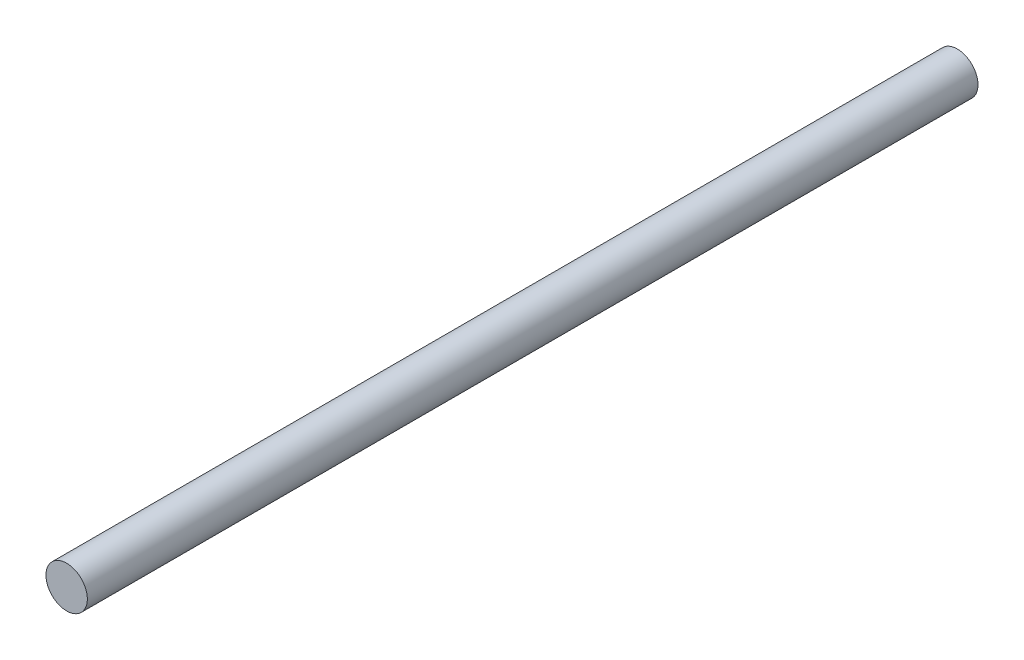
ISO-10303-21;
HEADER;
FILE_DESCRIPTION(('STEP AP214'),'2;1');
FILE_NAME('part.step','',(''),(''),'','','');
FILE_SCHEMA(('AUTOMOTIVE_DESIGN { 1 0 10303 214 1 1 1 1 }'));
ENDSEC;
DATA;
#1=APPLICATION_CONTEXT('core data for automotive mechanical design processes');
#2=APPLICATION_PROTOCOL_DEFINITION('international standard','automotive_design',2000,#1);
#3=PRODUCT_CONTEXT('',#1,'mechanical');
#4=PRODUCT('Part','Part','',(#3));
#5=PRODUCT_RELATED_PRODUCT_CATEGORY('part','',(#4));
#6=PRODUCT_DEFINITION_FORMATION('','',#4);
#7=PRODUCT_DEFINITION_CONTEXT('part definition',#1,'design');
#8=PRODUCT_DEFINITION('design','',#6,#7);
#9=PRODUCT_DEFINITION_SHAPE('','',#8);
#10=(LENGTH_UNIT() NAMED_UNIT(*) SI_UNIT(.MILLI.,.METRE.));
#11=(NAMED_UNIT(*) PLANE_ANGLE_UNIT() SI_UNIT($,.RADIAN.));
#12=(NAMED_UNIT(*) SI_UNIT($,.STERADIAN.) SOLID_ANGLE_UNIT());
#13=UNCERTAINTY_MEASURE_WITH_UNIT(LENGTH_MEASURE(1.E-05),#10,'distance_accuracy_value','');
#14=(GEOMETRIC_REPRESENTATION_CONTEXT(3) GLOBAL_UNCERTAINTY_ASSIGNED_CONTEXT((#13)) GLOBAL_UNIT_ASSIGNED_CONTEXT((#10,
#11,#12)) REPRESENTATION_CONTEXT('',''));
#15=CARTESIAN_POINT('',(0.,0.,0.));
#16=DIRECTION('',(0.,0.,1.));
#17=DIRECTION('',(1.,0.,0.));
#18=AXIS2_PLACEMENT_3D('',#15,#16,#17);
#19=CARTESIAN_POINT('',(0.,44.6491228070175,70.));
#20=DIRECTION('',(0.,0.,-1.));
#21=DIRECTION('',(-1.,0.,0.));
#22=AXIS2_PLACEMENT_3D('',#19,#20,#21);
#23=CYLINDRICAL_SURFACE('',#22,3.025);
#24=CARTESIAN_POINT('',(0.,44.6491228070175,-60.2));
#25=DIRECTION('',(0.,0.,1.));
#26=DIRECTION('',(1.,0.,0.));
#27=AXIS2_PLACEMENT_3D('',#24,#25,#26);
#28=CIRCLE('',#27,3.025);
#29=CARTESIAN_POINT('',(3.025,44.6491228070175,-60.2));
#30=VERTEX_POINT('',#29);
#31=EDGE_CURVE('E45',#30,#30,#28,.T.);
#32=ORIENTED_EDGE('',*,*,#31,.T.);
#33=EDGE_LOOP('',(#32));
#34=FACE_BOUND('',#33,.T.);
#35=CARTESIAN_POINT('',(0.,44.6491228070175,70.));
#36=DIRECTION('',(0.,0.,1.));
#37=DIRECTION('',(1.,0.,0.));
#38=AXIS2_PLACEMENT_3D('',#35,#36,#37);
#39=CIRCLE('',#38,3.025);
#40=CARTESIAN_POINT('',(3.025,44.6491228070175,70.));
#41=VERTEX_POINT('',#40);
#42=EDGE_CURVE('E12',#41,#41,#39,.T.);
#43=ORIENTED_EDGE('',*,*,#42,.F.);
#44=EDGE_LOOP('',(#43));
#45=FACE_BOUND('',#44,.T.);
#46=ADVANCED_FACE('F42',(#34,#45),#23,.T.);
#47=CARTESIAN_POINT('',(0.,44.6491228070175,70.));
#48=DIRECTION('',(0.,0.,1.));
#49=DIRECTION('',(1.,0.,0.));
#50=AXIS2_PLACEMENT_3D('',#47,#48,#49);
#51=PLANE('',#50);
#52=ORIENTED_EDGE('',*,*,#42,.T.);
#53=EDGE_LOOP('',(#52));
#54=FACE_BOUND('',#53,.T.);
#55=ADVANCED_FACE('F58',(#54),#51,.T.);
#56=CARTESIAN_POINT('',(-10.,47.6913599502299,-60.2));
#57=DIRECTION('',(0.,0.,1.));
#58=DIRECTION('',(1.,0.,0.));
#59=AXIS2_PLACEMENT_3D('',#56,#57,#58);
#60=PLANE('',#59);
#61=ORIENTED_EDGE('',*,*,#31,.F.);
#62=EDGE_LOOP('',(#61));
#63=FACE_BOUND('',#62,.T.);
#64=ADVANCED_FACE('F56',(#63),#60,.F.);
#65=CLOSED_SHELL('',(#46,#55,#64));
#66=MANIFOLD_SOLID_BREP('B2',#65);
#67=ADVANCED_BREP_SHAPE_REPRESENTATION('',(#18,#66),#14);
#68=SHAPE_DEFINITION_REPRESENTATION(#9,#67);
ENDSEC;
END-ISO-10303-21;
